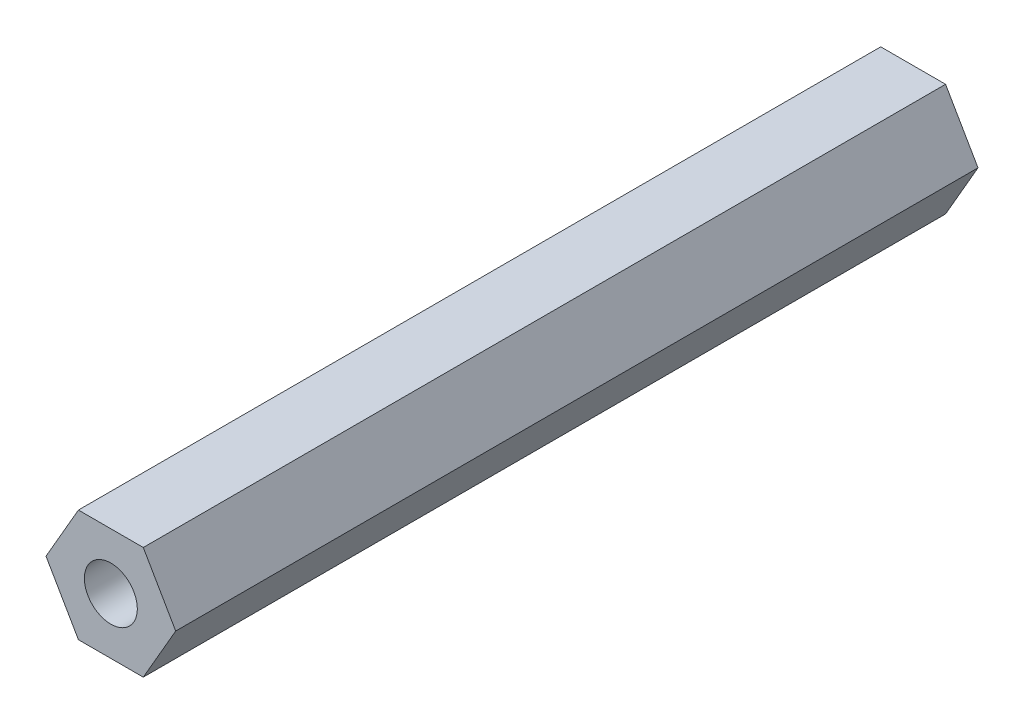
ISO-10303-21;
HEADER;
FILE_DESCRIPTION(('STEP AP214'),'2;1');
FILE_NAME('part.step','',(''),(''),'','','');
FILE_SCHEMA(('AUTOMOTIVE_DESIGN { 1 0 10303 214 1 1 1 1 }'));
ENDSEC;
DATA;
#1=APPLICATION_CONTEXT('core data for automotive mechanical design processes');
#2=APPLICATION_PROTOCOL_DEFINITION('international standard','automotive_design',2000,#1);
#3=PRODUCT_CONTEXT('',#1,'mechanical');
#4=PRODUCT('Part','Part','',(#3));
#5=PRODUCT_RELATED_PRODUCT_CATEGORY('part','',(#4));
#6=PRODUCT_DEFINITION_FORMATION('','',#4);
#7=PRODUCT_DEFINITION_CONTEXT('part definition',#1,'design');
#8=PRODUCT_DEFINITION('design','',#6,#7);
#9=PRODUCT_DEFINITION_SHAPE('','',#8);
#10=(LENGTH_UNIT() NAMED_UNIT(*) SI_UNIT(.MILLI.,.METRE.));
#11=(NAMED_UNIT(*) PLANE_ANGLE_UNIT() SI_UNIT($,.RADIAN.));
#12=(NAMED_UNIT(*) SI_UNIT($,.STERADIAN.) SOLID_ANGLE_UNIT());
#13=UNCERTAINTY_MEASURE_WITH_UNIT(LENGTH_MEASURE(1.E-05),#10,'distance_accuracy_value','');
#14=(GEOMETRIC_REPRESENTATION_CONTEXT(3) GLOBAL_UNCERTAINTY_ASSIGNED_CONTEXT((#13)) GLOBAL_UNIT_ASSIGNED_CONTEXT((#10,
#11,#12)) REPRESENTATION_CONTEXT('',''));
#15=CARTESIAN_POINT('',(0.,0.,0.));
#16=DIRECTION('',(0.,0.,1.));
#17=DIRECTION('',(1.,0.,0.));
#18=AXIS2_PLACEMENT_3D('',#15,#16,#17);
#19=CARTESIAN_POINT('',(2.02072594216373,-3.49999999999998,50.));
#20=DIRECTION('',(-0.866025403784442,0.499999999999995,0.));
#21=DIRECTION('',(-0.499999999999995,-0.866025403784442,0.));
#22=AXIS2_PLACEMENT_3D('',#19,#20,#21);
#23=PLANE('',#22);
#24=DIRECTION('',(0.499999999999995,0.866025403784442,0.));
#25=VECTOR('',#24,1.);
#26=CARTESIAN_POINT('',(2.02072594216373,-3.49999999999998,0.));
#27=LINE('',#26,#25);
#28=CARTESIAN_POINT('',(2.02072594216373,-3.49999999999998,0.));
#29=VERTEX_POINT('',#28);
#30=CARTESIAN_POINT('',(4.04145188432738,0.,0.));
#31=VERTEX_POINT('',#30);
#32=EDGE_CURVE('E117',#29,#31,#27,.T.);
#33=ORIENTED_EDGE('',*,*,#32,.T.);
#34=DIRECTION('',(0.,0.,-1.));
#35=VECTOR('',#34,1.);
#36=CARTESIAN_POINT('',(4.04145188432738,0.,50.));
#37=LINE('',#36,#35);
#38=CARTESIAN_POINT('',(4.04145188432738,0.,50.));
#39=VERTEX_POINT('',#38);
#40=EDGE_CURVE('E11',#39,#31,#37,.T.);
#41=ORIENTED_EDGE('',*,*,#40,.F.);
#42=DIRECTION('',(0.499999999999995,0.866025403784442,0.));
#43=VECTOR('',#42,1.);
#44=CARTESIAN_POINT('',(2.02072594216373,-3.49999999999998,50.));
#45=LINE('',#44,#43);
#46=CARTESIAN_POINT('',(2.02072594216373,-3.49999999999998,50.));
#47=VERTEX_POINT('',#46);
#48=EDGE_CURVE('E128',#47,#39,#45,.T.);
#49=ORIENTED_EDGE('',*,*,#48,.F.);
#50=DIRECTION('',(0.,0.,-1.));
#51=VECTOR('',#50,1.);
#52=CARTESIAN_POINT('',(2.02072594216373,-3.49999999999998,50.));
#53=LINE('',#52,#51);
#54=EDGE_CURVE('E113',#47,#29,#53,.T.);
#55=ORIENTED_EDGE('',*,*,#54,.T.);
#56=EDGE_LOOP('',(#33,#41,#49,#55));
#57=FACE_BOUND('',#56,.T.);
#58=ADVANCED_FACE('F33',(#57),#23,.F.);
#59=CARTESIAN_POINT('',(4.04145188432738,0.,50.));
#60=DIRECTION('',(-0.866025403784438,-0.500000000000001,0.));
#61=DIRECTION('',(0.500000000000001,-0.866025403784438,0.));
#62=AXIS2_PLACEMENT_3D('',#59,#60,#61);
#63=PLANE('',#62);
#64=DIRECTION('',(-0.500000000000001,0.866025403784438,0.));
#65=VECTOR('',#64,1.);
#66=CARTESIAN_POINT('',(4.04145188432738,0.,0.));
#67=LINE('',#66,#65);
#68=CARTESIAN_POINT('',(2.02072594216368,3.50000000000001,0.));
#69=VERTEX_POINT('',#68);
#70=EDGE_CURVE('E120',#31,#69,#67,.T.);
#71=ORIENTED_EDGE('',*,*,#70,.T.);
#72=DIRECTION('',(0.,0.,-1.));
#73=VECTOR('',#72,1.);
#74=CARTESIAN_POINT('',(2.02072594216368,3.50000000000001,50.));
#75=LINE('',#74,#73);
#76=CARTESIAN_POINT('',(2.02072594216368,3.50000000000001,50.));
#77=VERTEX_POINT('',#76);
#78=EDGE_CURVE('E41',#77,#69,#75,.T.);
#79=ORIENTED_EDGE('',*,*,#78,.F.);
#80=DIRECTION('',(-0.500000000000001,0.866025403784438,0.));
#81=VECTOR('',#80,1.);
#82=CARTESIAN_POINT('',(4.04145188432738,0.,50.));
#83=LINE('',#82,#81);
#84=EDGE_CURVE('E86',#39,#77,#83,.T.);
#85=ORIENTED_EDGE('',*,*,#84,.F.);
#86=ORIENTED_EDGE('',*,*,#40,.T.);
#87=EDGE_LOOP('',(#71,#79,#85,#86));
#88=FACE_BOUND('',#87,.T.);
#89=ADVANCED_FACE('F153',(#88),#63,.F.);
#90=CARTESIAN_POINT('',(2.02072594216368,3.50000000000001,50.));
#91=DIRECTION('',(0.,-1.,0.));
#92=DIRECTION('',(1.,0.,0.));
#93=AXIS2_PLACEMENT_3D('',#90,#91,#92);
#94=PLANE('',#93);
#95=DIRECTION('',(-1.,0.,0.));
#96=VECTOR('',#95,1.);
#97=CARTESIAN_POINT('',(2.02072594216368,3.50000000000001,0.));
#98=LINE('',#97,#96);
#99=CARTESIAN_POINT('',(-2.02072594216371,3.49999999999999,0.));
#100=VERTEX_POINT('',#99);
#101=EDGE_CURVE('E123',#69,#100,#98,.T.);
#102=ORIENTED_EDGE('',*,*,#101,.T.);
#103=DIRECTION('',(0.,0.,-1.));
#104=VECTOR('',#103,1.);
#105=CARTESIAN_POINT('',(-2.02072594216371,3.49999999999999,50.));
#106=LINE('',#105,#104);
#107=CARTESIAN_POINT('',(-2.02072594216371,3.49999999999999,50.));
#108=VERTEX_POINT('',#107);
#109=EDGE_CURVE('E108',#108,#100,#106,.T.);
#110=ORIENTED_EDGE('',*,*,#109,.F.);
#111=DIRECTION('',(-1.,0.,0.));
#112=VECTOR('',#111,1.);
#113=CARTESIAN_POINT('',(2.02072594216368,3.50000000000001,50.));
#114=LINE('',#113,#112);
#115=EDGE_CURVE('E99',#77,#108,#114,.T.);
#116=ORIENTED_EDGE('',*,*,#115,.F.);
#117=ORIENTED_EDGE('',*,*,#78,.T.);
#118=EDGE_LOOP('',(#102,#110,#116,#117));
#119=FACE_BOUND('',#118,.T.);
#120=ADVANCED_FACE('F134',(#119),#94,.F.);
#121=CARTESIAN_POINT('',(-2.02072594216371,3.49999999999999,50.));
#122=DIRECTION('',(0.866025403784441,-0.499999999999995,0.));
#123=DIRECTION('',(0.499999999999995,0.866025403784441,0.));
#124=AXIS2_PLACEMENT_3D('',#121,#122,#123);
#125=PLANE('',#124);
#126=DIRECTION('',(-0.499999999999995,-0.866025403784441,0.));
#127=VECTOR('',#126,1.);
#128=CARTESIAN_POINT('',(-2.02072594216371,3.49999999999999,0.));
#129=LINE('',#128,#127);
#130=CARTESIAN_POINT('',(-4.04145188432738,0.,0.));
#131=VERTEX_POINT('',#130);
#132=EDGE_CURVE('E107',#100,#131,#129,.T.);
#133=ORIENTED_EDGE('',*,*,#132,.T.);
#134=DIRECTION('',(0.,0.,-1.));
#135=VECTOR('',#134,1.);
#136=CARTESIAN_POINT('',(-4.04145188432738,0.,50.));
#137=LINE('',#136,#135);
#138=CARTESIAN_POINT('',(-4.04145188432738,0.,50.));
#139=VERTEX_POINT('',#138);
#140=EDGE_CURVE('E104',#139,#131,#137,.T.);
#141=ORIENTED_EDGE('',*,*,#140,.F.);
#142=DIRECTION('',(-0.499999999999995,-0.866025403784441,0.));
#143=VECTOR('',#142,1.);
#144=CARTESIAN_POINT('',(-2.02072594216371,3.49999999999999,50.));
#145=LINE('',#144,#143);
#146=EDGE_CURVE('E93',#108,#139,#145,.T.);
#147=ORIENTED_EDGE('',*,*,#146,.F.);
#148=ORIENTED_EDGE('',*,*,#109,.T.);
#149=EDGE_LOOP('',(#133,#141,#147,#148));
#150=FACE_BOUND('',#149,.T.);
#151=ADVANCED_FACE('F105',(#150),#125,.F.);
#152=CARTESIAN_POINT('',(-4.04145188432738,0.,50.));
#153=DIRECTION('',(0.866025403784435,0.500000000000007,0.));
#154=DIRECTION('',(-0.500000000000007,0.866025403784435,0.));
#155=AXIS2_PLACEMENT_3D('',#152,#153,#154);
#156=PLANE('',#155);
#157=DIRECTION('',(0.500000000000007,-0.866025403784435,0.));
#158=VECTOR('',#157,1.);
#159=CARTESIAN_POINT('',(-4.04145188432738,0.,0.));
#160=LINE('',#159,#158);
#161=CARTESIAN_POINT('',(-2.02072594216366,-3.50000000000002,0.));
#162=VERTEX_POINT('',#161);
#163=EDGE_CURVE('E72',#131,#162,#160,.T.);
#164=ORIENTED_EDGE('',*,*,#163,.T.);
#165=DIRECTION('',(0.,0.,-1.));
#166=VECTOR('',#165,1.);
#167=CARTESIAN_POINT('',(-2.02072594216366,-3.50000000000002,50.));
#168=LINE('',#167,#166);
#169=CARTESIAN_POINT('',(-2.02072594216366,-3.50000000000002,50.));
#170=VERTEX_POINT('',#169);
#171=EDGE_CURVE('E109',#170,#162,#168,.T.);
#172=ORIENTED_EDGE('',*,*,#171,.F.);
#173=DIRECTION('',(0.500000000000007,-0.866025403784435,0.));
#174=VECTOR('',#173,1.);
#175=CARTESIAN_POINT('',(-4.04145188432738,0.,50.));
#176=LINE('',#175,#174);
#177=EDGE_CURVE('E97',#139,#170,#176,.T.);
#178=ORIENTED_EDGE('',*,*,#177,.F.);
#179=ORIENTED_EDGE('',*,*,#140,.T.);
#180=EDGE_LOOP('',(#164,#172,#178,#179));
#181=FACE_BOUND('',#180,.T.);
#182=ADVANCED_FACE('F111',(#181),#156,.F.);
#183=CARTESIAN_POINT('',(-2.02072594216366,-3.50000000000002,50.));
#184=DIRECTION('',(0.,1.,0.));
#185=DIRECTION('',(-1.,0.,0.));
#186=AXIS2_PLACEMENT_3D('',#183,#184,#185);
#187=PLANE('',#186);
#188=DIRECTION('',(1.,0.,0.));
#189=VECTOR('',#188,1.);
#190=CARTESIAN_POINT('',(-2.02072594216366,-3.50000000000002,0.));
#191=LINE('',#190,#189);
#192=EDGE_CURVE('E78',#162,#29,#191,.T.);
#193=ORIENTED_EDGE('',*,*,#192,.T.);
#194=ORIENTED_EDGE('',*,*,#54,.F.);
#195=DIRECTION('',(1.,0.,0.));
#196=VECTOR('',#195,1.);
#197=CARTESIAN_POINT('',(-2.02072594216366,-3.50000000000002,50.));
#198=LINE('',#197,#196);
#199=EDGE_CURVE('E49',#170,#47,#198,.T.);
#200=ORIENTED_EDGE('',*,*,#199,.F.);
#201=ORIENTED_EDGE('',*,*,#171,.T.);
#202=EDGE_LOOP('',(#193,#194,#200,#201));
#203=FACE_BOUND('',#202,.T.);
#204=ADVANCED_FACE('F141',(#203),#187,.F.);
#205=CARTESIAN_POINT('',(0.,0.,50.));
#206=DIRECTION('',(0.,0.,1.));
#207=DIRECTION('',(1.,0.,0.));
#208=AXIS2_PLACEMENT_3D('',#205,#206,#207);
#209=PLANE('',#208);
#210=CARTESIAN_POINT('',(0.,0.,50.));
#211=DIRECTION('',(0.,0.,1.));
#212=DIRECTION('',(1.,0.,0.));
#213=AXIS2_PLACEMENT_3D('',#210,#211,#212);
#214=CIRCLE('',#213,1.65);
#215=CARTESIAN_POINT('',(1.65,0.,50.));
#216=VERTEX_POINT('',#215);
#217=EDGE_CURVE('E236',#216,#216,#214,.T.);
#218=ORIENTED_EDGE('',*,*,#217,.F.);
#219=EDGE_LOOP('',(#218));
#220=FACE_BOUND('',#219,.T.);
#221=ORIENTED_EDGE('',*,*,#48,.T.);
#222=ORIENTED_EDGE('',*,*,#84,.T.);
#223=ORIENTED_EDGE('',*,*,#115,.T.);
#224=ORIENTED_EDGE('',*,*,#146,.T.);
#225=ORIENTED_EDGE('',*,*,#177,.T.);
#226=ORIENTED_EDGE('',*,*,#199,.T.);
#227=EDGE_LOOP('',(#221,#222,#223,#224,#225,#226));
#228=FACE_BOUND('',#227,.T.);
#229=ADVANCED_FACE('F95',(#220,#228),#209,.T.);
#230=CARTESIAN_POINT('',(0.,0.,0.));
#231=DIRECTION('',(0.,0.,1.));
#232=DIRECTION('',(1.,0.,0.));
#233=AXIS2_PLACEMENT_3D('',#230,#231,#232);
#234=PLANE('',#233);
#235=CARTESIAN_POINT('',(0.,0.,0.));
#236=DIRECTION('',(0.,0.,1.));
#237=DIRECTION('',(1.,0.,0.));
#238=AXIS2_PLACEMENT_3D('',#235,#236,#237);
#239=CIRCLE('',#238,1.65);
#240=CARTESIAN_POINT('',(1.65,0.,0.));
#241=VERTEX_POINT('',#240);
#242=EDGE_CURVE('E237',#241,#241,#239,.T.);
#243=ORIENTED_EDGE('',*,*,#242,.T.);
#244=EDGE_LOOP('',(#243));
#245=FACE_BOUND('',#244,.T.);
#246=ORIENTED_EDGE('',*,*,#32,.F.);
#247=ORIENTED_EDGE('',*,*,#192,.F.);
#248=ORIENTED_EDGE('',*,*,#163,.F.);
#249=ORIENTED_EDGE('',*,*,#132,.F.);
#250=ORIENTED_EDGE('',*,*,#101,.F.);
#251=ORIENTED_EDGE('',*,*,#70,.F.);
#252=EDGE_LOOP('',(#246,#247,#248,#249,#250,#251));
#253=FACE_BOUND('',#252,.T.);
#254=ADVANCED_FACE('F137',(#245,#253),#234,.F.);
#255=CARTESIAN_POINT('',(0.,0.,41.));
#256=DIRECTION('',(0.,0.,1.));
#257=DIRECTION('',(1.,0.,0.));
#258=AXIS2_PLACEMENT_3D('',#255,#256,#257);
#259=CYLINDRICAL_SURFACE('',#258,1.65);
#260=CARTESIAN_POINT('',(0.,0.,41.));
#261=DIRECTION('',(0.,0.,1.));
#262=DIRECTION('',(1.,0.,0.));
#263=AXIS2_PLACEMENT_3D('',#260,#261,#262);
#264=CIRCLE('',#263,1.65);
#265=CARTESIAN_POINT('',(1.65,0.,41.));
#266=VERTEX_POINT('',#265);
#267=EDGE_CURVE('E121',#266,#266,#264,.T.);
#268=ORIENTED_EDGE('',*,*,#267,.F.);
#269=EDGE_LOOP('',(#268));
#270=FACE_BOUND('',#269,.T.);
#271=ORIENTED_EDGE('',*,*,#217,.T.);
#272=EDGE_LOOP('',(#271));
#273=FACE_BOUND('',#272,.T.);
#274=ADVANCED_FACE('F188',(#270,#273),#259,.F.);
#275=CARTESIAN_POINT('',(0.,0.,41.));
#276=DIRECTION('',(0.,0.,1.));
#277=DIRECTION('',(1.,0.,0.));
#278=AXIS2_PLACEMENT_3D('',#275,#276,#277);
#279=PLANE('',#278);
#280=ORIENTED_EDGE('',*,*,#267,.T.);
#281=EDGE_LOOP('',(#280));
#282=FACE_BOUND('',#281,.T.);
#283=ADVANCED_FACE('F193',(#282),#279,.T.);
#284=CARTESIAN_POINT('',(0.,0.,9.));
#285=DIRECTION('',(0.,0.,-1.));
#286=DIRECTION('',(-1.,0.,0.));
#287=AXIS2_PLACEMENT_3D('',#284,#285,#286);
#288=CYLINDRICAL_SURFACE('',#287,1.65);
#289=CARTESIAN_POINT('',(0.,0.,9.));
#290=DIRECTION('',(0.,0.,1.));
#291=DIRECTION('',(1.,0.,0.));
#292=AXIS2_PLACEMENT_3D('',#289,#290,#291);
#293=CIRCLE('',#292,1.65);
#294=CARTESIAN_POINT('',(1.65,0.,9.));
#295=VERTEX_POINT('',#294);
#296=EDGE_CURVE('E235',#295,#295,#293,.T.);
#297=ORIENTED_EDGE('',*,*,#296,.T.);
#298=EDGE_LOOP('',(#297));
#299=FACE_BOUND('',#298,.T.);
#300=ORIENTED_EDGE('',*,*,#242,.F.);
#301=EDGE_LOOP('',(#300));
#302=FACE_BOUND('',#301,.T.);
#303=ADVANCED_FACE('F203',(#299,#302),#288,.F.);
#304=CARTESIAN_POINT('',(0.,0.,9.));
#305=DIRECTION('',(0.,0.,1.));
#306=DIRECTION('',(1.,0.,0.));
#307=AXIS2_PLACEMENT_3D('',#304,#305,#306);
#308=PLANE('',#307);
#309=ORIENTED_EDGE('',*,*,#296,.F.);
#310=EDGE_LOOP('',(#309));
#311=FACE_BOUND('',#310,.T.);
#312=ADVANCED_FACE('F219',(#311),#308,.F.);
#313=CLOSED_SHELL('',(#58,#89,#120,#151,#182,#204,#229,#254,#274,#283,#303,#312));
#314=MANIFOLD_SOLID_BREP('B2',#313);
#315=ADVANCED_BREP_SHAPE_REPRESENTATION('',(#18,#314),#14);
#316=SHAPE_DEFINITION_REPRESENTATION(#9,#315);
ENDSEC;
END-ISO-10303-21;
